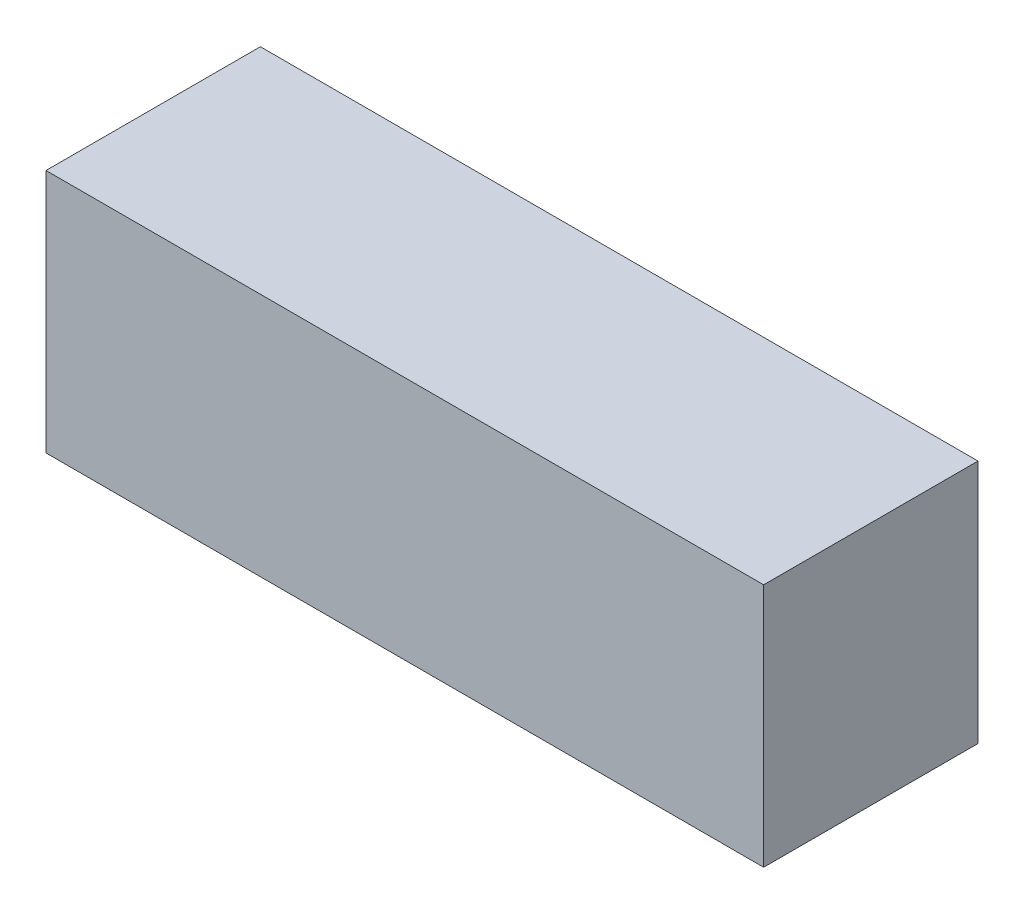
ISO-10303-21;
HEADER;
FILE_DESCRIPTION(('STEP AP214'),'2;1');
FILE_NAME('part.step','',(''),(''),'','','');
FILE_SCHEMA(('AUTOMOTIVE_DESIGN { 1 0 10303 214 1 1 1 1 }'));
ENDSEC;
DATA;
#1=APPLICATION_CONTEXT('core data for automotive mechanical design processes');
#2=APPLICATION_PROTOCOL_DEFINITION('international standard','automotive_design',2000,#1);
#3=PRODUCT_CONTEXT('',#1,'mechanical');
#4=PRODUCT('Part','Part','',(#3));
#5=PRODUCT_RELATED_PRODUCT_CATEGORY('part','',(#4));
#6=PRODUCT_DEFINITION_FORMATION('','',#4);
#7=PRODUCT_DEFINITION_CONTEXT('part definition',#1,'design');
#8=PRODUCT_DEFINITION('design','',#6,#7);
#9=PRODUCT_DEFINITION_SHAPE('','',#8);
#10=(LENGTH_UNIT() NAMED_UNIT(*) SI_UNIT(.MILLI.,.METRE.));
#11=(NAMED_UNIT(*) PLANE_ANGLE_UNIT() SI_UNIT($,.RADIAN.));
#12=(NAMED_UNIT(*) SI_UNIT($,.STERADIAN.) SOLID_ANGLE_UNIT());
#13=UNCERTAINTY_MEASURE_WITH_UNIT(LENGTH_MEASURE(1.E-05),#10,'distance_accuracy_value','');
#14=(GEOMETRIC_REPRESENTATION_CONTEXT(3) GLOBAL_UNCERTAINTY_ASSIGNED_CONTEXT((#13)) GLOBAL_UNIT_ASSIGNED_CONTEXT((#10,
#11,#12)) REPRESENTATION_CONTEXT('',''));
#15=CARTESIAN_POINT('',(0.,0.,0.));
#16=DIRECTION('',(0.,0.,1.));
#17=DIRECTION('',(1.,0.,0.));
#18=AXIS2_PLACEMENT_3D('',#15,#16,#17);
#19=CARTESIAN_POINT('',(154.,-26.25,-23.));
#20=DIRECTION('',(0.,0.,1.));
#21=DIRECTION('',(1.,0.,0.));
#22=AXIS2_PLACEMENT_3D('',#19,#20,#21);
#23=PLANE('',#22);
#24=DIRECTION('',(0.,1.,0.));
#25=VECTOR('',#24,1.);
#26=CARTESIAN_POINT('',(0.,-26.25,-23.));
#27=LINE('',#26,#25);
#28=CARTESIAN_POINT('',(0.,-26.25,-23.));
#29=VERTEX_POINT('',#28);
#30=CARTESIAN_POINT('',(0.,26.25,-23.));
#31=VERTEX_POINT('',#30);
#32=EDGE_CURVE('E104',#29,#31,#27,.T.);
#33=ORIENTED_EDGE('',*,*,#32,.T.);
#34=DIRECTION('',(-1.,0.,0.));
#35=VECTOR('',#34,1.);
#36=CARTESIAN_POINT('',(154.,26.25,-23.));
#37=LINE('',#36,#35);
#38=CARTESIAN_POINT('',(154.,26.25,-23.));
#39=VERTEX_POINT('',#38);
#40=EDGE_CURVE('E11',#39,#31,#37,.T.);
#41=ORIENTED_EDGE('',*,*,#40,.F.);
#42=DIRECTION('',(0.,1.,0.));
#43=VECTOR('',#42,1.);
#44=CARTESIAN_POINT('',(154.,-26.25,-23.));
#45=LINE('',#44,#43);
#46=CARTESIAN_POINT('',(154.,-26.25,-23.));
#47=VERTEX_POINT('',#46);
#48=EDGE_CURVE('E92',#47,#39,#45,.T.);
#49=ORIENTED_EDGE('',*,*,#48,.F.);
#50=DIRECTION('',(-1.,0.,0.));
#51=VECTOR('',#50,1.);
#52=CARTESIAN_POINT('',(154.,-26.25,-23.));
#53=LINE('',#52,#51);
#54=EDGE_CURVE('E100',#47,#29,#53,.T.);
#55=ORIENTED_EDGE('',*,*,#54,.T.);
#56=EDGE_LOOP('',(#33,#41,#49,#55));
#57=FACE_BOUND('',#56,.T.);
#58=ADVANCED_FACE('F41',(#57),#23,.F.);
#59=CARTESIAN_POINT('',(154.,26.25,23.));
#60=DIRECTION('',(0.,-1.,0.));
#61=DIRECTION('',(0.,0.,-1.));
#62=AXIS2_PLACEMENT_3D('',#59,#60,#61);
#63=PLANE('',#62);
#64=DIRECTION('',(0.,0.,1.));
#65=VECTOR('',#64,1.);
#66=CARTESIAN_POINT('',(0.,26.25,23.));
#67=LINE('',#66,#65);
#68=CARTESIAN_POINT('',(0.,26.25,23.));
#69=VERTEX_POINT('',#68);
#70=EDGE_CURVE('E96',#31,#69,#67,.T.);
#71=ORIENTED_EDGE('',*,*,#70,.T.);
#72=DIRECTION('',(-1.,0.,0.));
#73=VECTOR('',#72,1.);
#74=CARTESIAN_POINT('',(154.,26.25,23.));
#75=LINE('',#74,#73);
#76=CARTESIAN_POINT('',(154.,26.25,23.));
#77=VERTEX_POINT('',#76);
#78=EDGE_CURVE('E49',#77,#69,#75,.T.);
#79=ORIENTED_EDGE('',*,*,#78,.F.);
#80=DIRECTION('',(0.,0.,1.));
#81=VECTOR('',#80,1.);
#82=CARTESIAN_POINT('',(154.,26.25,23.));
#83=LINE('',#82,#81);
#84=EDGE_CURVE('E87',#39,#77,#83,.T.);
#85=ORIENTED_EDGE('',*,*,#84,.F.);
#86=ORIENTED_EDGE('',*,*,#40,.T.);
#87=EDGE_LOOP('',(#71,#79,#85,#86));
#88=FACE_BOUND('',#87,.T.);
#89=ADVANCED_FACE('F95',(#88),#63,.F.);
#90=CARTESIAN_POINT('',(154.,-26.25,23.));
#91=DIRECTION('',(0.,0.,-1.));
#92=DIRECTION('',(-1.,0.,0.));
#93=AXIS2_PLACEMENT_3D('',#90,#91,#92);
#94=PLANE('',#93);
#95=DIRECTION('',(0.,-1.,0.));
#96=VECTOR('',#95,1.);
#97=CARTESIAN_POINT('',(0.,-26.25,23.));
#98=LINE('',#97,#96);
#99=CARTESIAN_POINT('',(0.,-26.25,23.));
#100=VERTEX_POINT('',#99);
#101=EDGE_CURVE('E74',#69,#100,#98,.T.);
#102=ORIENTED_EDGE('',*,*,#101,.T.);
#103=DIRECTION('',(-1.,0.,0.));
#104=VECTOR('',#103,1.);
#105=CARTESIAN_POINT('',(154.,-26.25,23.));
#106=LINE('',#105,#104);
#107=CARTESIAN_POINT('',(154.,-26.25,23.));
#108=VERTEX_POINT('',#107);
#109=EDGE_CURVE('E97',#108,#100,#106,.T.);
#110=ORIENTED_EDGE('',*,*,#109,.F.);
#111=DIRECTION('',(0.,-1.,0.));
#112=VECTOR('',#111,1.);
#113=CARTESIAN_POINT('',(154.,-26.25,23.));
#114=LINE('',#113,#112);
#115=EDGE_CURVE('E90',#77,#108,#114,.T.);
#116=ORIENTED_EDGE('',*,*,#115,.F.);
#117=ORIENTED_EDGE('',*,*,#78,.T.);
#118=EDGE_LOOP('',(#102,#110,#116,#117));
#119=FACE_BOUND('',#118,.T.);
#120=ADVANCED_FACE('F98',(#119),#94,.F.);
#121=CARTESIAN_POINT('',(154.,-26.25,23.));
#122=DIRECTION('',(0.,1.,0.));
#123=DIRECTION('',(0.,0.,1.));
#124=AXIS2_PLACEMENT_3D('',#121,#122,#123);
#125=PLANE('',#124);
#126=DIRECTION('',(0.,0.,-1.));
#127=VECTOR('',#126,1.);
#128=CARTESIAN_POINT('',(0.,-26.25,23.));
#129=LINE('',#128,#127);
#130=EDGE_CURVE('E80',#100,#29,#129,.T.);
#131=ORIENTED_EDGE('',*,*,#130,.T.);
#132=ORIENTED_EDGE('',*,*,#54,.F.);
#133=DIRECTION('',(0.,0.,-1.));
#134=VECTOR('',#133,1.);
#135=CARTESIAN_POINT('',(154.,-26.25,23.));
#136=LINE('',#135,#134);
#137=EDGE_CURVE('E57',#108,#47,#136,.T.);
#138=ORIENTED_EDGE('',*,*,#137,.F.);
#139=ORIENTED_EDGE('',*,*,#109,.T.);
#140=EDGE_LOOP('',(#131,#132,#138,#139));
#141=FACE_BOUND('',#140,.T.);
#142=ADVANCED_FACE('F111',(#141),#125,.F.);
#143=CARTESIAN_POINT('',(154.,0.,0.));
#144=DIRECTION('',(-1.,0.,0.));
#145=DIRECTION('',(0.,0.,1.));
#146=AXIS2_PLACEMENT_3D('',#143,#144,#145);
#147=PLANE('',#146);
#148=ORIENTED_EDGE('',*,*,#48,.T.);
#149=ORIENTED_EDGE('',*,*,#84,.T.);
#150=ORIENTED_EDGE('',*,*,#115,.T.);
#151=ORIENTED_EDGE('',*,*,#137,.T.);
#152=EDGE_LOOP('',(#148,#149,#150,#151));
#153=FACE_BOUND('',#152,.T.);
#154=ADVANCED_FACE('F88',(#153),#147,.F.);
#155=CARTESIAN_POINT('',(0.,0.,0.));
#156=DIRECTION('',(-1.,0.,0.));
#157=DIRECTION('',(0.,0.,1.));
#158=AXIS2_PLACEMENT_3D('',#155,#156,#157);
#159=PLANE('',#158);
#160=ORIENTED_EDGE('',*,*,#32,.F.);
#161=ORIENTED_EDGE('',*,*,#130,.F.);
#162=ORIENTED_EDGE('',*,*,#101,.F.);
#163=ORIENTED_EDGE('',*,*,#70,.F.);
#164=EDGE_LOOP('',(#160,#161,#162,#163));
#165=FACE_BOUND('',#164,.T.);
#166=ADVANCED_FACE('F114',(#165),#159,.T.);
#167=CLOSED_SHELL('',(#58,#89,#120,#142,#154,#166));
#168=MANIFOLD_SOLID_BREP('B2',#167);
#169=ADVANCED_BREP_SHAPE_REPRESENTATION('',(#18,#168),#14);
#170=SHAPE_DEFINITION_REPRESENTATION(#9,#169);
ENDSEC;
END-ISO-10303-21;
